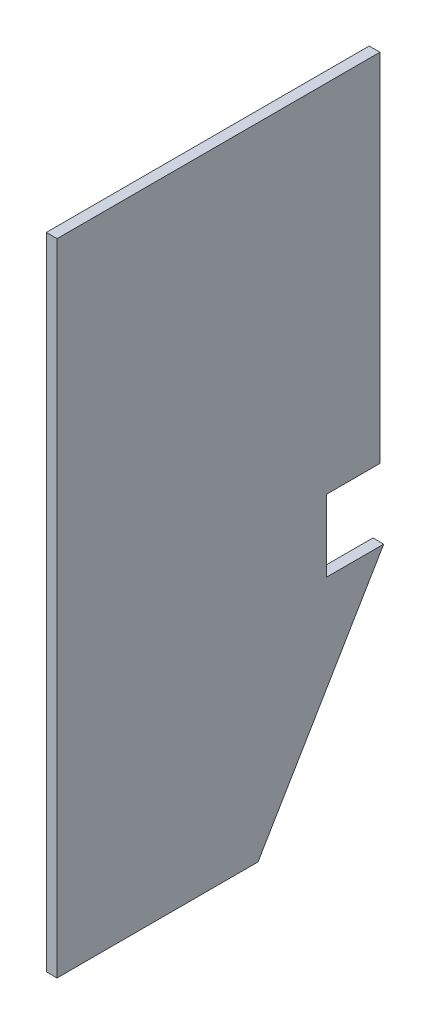
ISO-10303-21;
HEADER;
FILE_DESCRIPTION(('STEP AP214'),'2;1');
FILE_NAME('part.step','',(''),(''),'','','');
FILE_SCHEMA(('AUTOMOTIVE_DESIGN { 1 0 10303 214 1 1 1 1 }'));
ENDSEC;
DATA;
#1=APPLICATION_CONTEXT('core data for automotive mechanical design processes');
#2=APPLICATION_PROTOCOL_DEFINITION('international standard','automotive_design',2000,#1);
#3=PRODUCT_CONTEXT('',#1,'mechanical');
#4=PRODUCT('Part','Part','',(#3));
#5=PRODUCT_RELATED_PRODUCT_CATEGORY('part','',(#4));
#6=PRODUCT_DEFINITION_FORMATION('','',#4);
#7=PRODUCT_DEFINITION_CONTEXT('part definition',#1,'design');
#8=PRODUCT_DEFINITION('design','',#6,#7);
#9=PRODUCT_DEFINITION_SHAPE('','',#8);
#10=(LENGTH_UNIT() NAMED_UNIT(*) SI_UNIT(.MILLI.,.METRE.));
#11=(NAMED_UNIT(*) PLANE_ANGLE_UNIT() SI_UNIT($,.RADIAN.));
#12=(NAMED_UNIT(*) SI_UNIT($,.STERADIAN.) SOLID_ANGLE_UNIT());
#13=UNCERTAINTY_MEASURE_WITH_UNIT(LENGTH_MEASURE(1.E-05),#10,'distance_accuracy_value','');
#14=(GEOMETRIC_REPRESENTATION_CONTEXT(3) GLOBAL_UNCERTAINTY_ASSIGNED_CONTEXT((#13)) GLOBAL_UNIT_ASSIGNED_CONTEXT((#10,
#11,#12)) REPRESENTATION_CONTEXT('',''));
#15=CARTESIAN_POINT('',(0.,0.,0.));
#16=DIRECTION('',(0.,0.,1.));
#17=DIRECTION('',(1.,0.,0.));
#18=AXIS2_PLACEMENT_3D('',#15,#16,#17);
#19=CARTESIAN_POINT('',(6.,13.1217789679627,-475.450700314653));
#20=DIRECTION('',(0.,1.,0.));
#21=DIRECTION('',(0.,0.,-1.));
#22=AXIS2_PLACEMENT_3D('',#19,#20,#21);
#23=PLANE('',#22);
#24=DIRECTION('',(0.,0.,1.));
#25=VECTOR('',#24,1.);
#26=CARTESIAN_POINT('',(0.,13.1217789679627,-475.450700314653));
#27=LINE('',#26,#25);
#28=CARTESIAN_POINT('',(0.,13.1217789679627,-505.119316824062));
#29=VERTEX_POINT('',#28);
#30=CARTESIAN_POINT('',(0.,13.1217789679627,-475.450700314653));
#31=VERTEX_POINT('',#30);
#32=EDGE_CURVE('E138',#29,#31,#27,.T.);
#33=ORIENTED_EDGE('',*,*,#32,.F.);
#34=DIRECTION('',(-1.,0.,0.));
#35=VECTOR('',#34,1.);
#36=CARTESIAN_POINT('',(6.,13.1217789679627,-505.119316824062));
#37=LINE('',#36,#35);
#38=CARTESIAN_POINT('',(6.,13.1217789679627,-505.119316824062));
#39=VERTEX_POINT('',#38);
#40=EDGE_CURVE('E11',#39,#29,#37,.T.);
#41=ORIENTED_EDGE('',*,*,#40,.F.);
#42=DIRECTION('',(0.,0.,1.));
#43=VECTOR('',#42,1.);
#44=CARTESIAN_POINT('',(6.,13.1217789679627,-475.450700314653));
#45=LINE('',#44,#43);
#46=CARTESIAN_POINT('',(6.,13.1217789679627,-475.450700314653));
#47=VERTEX_POINT('',#46);
#48=EDGE_CURVE('E169',#39,#47,#45,.T.);
#49=ORIENTED_EDGE('',*,*,#48,.T.);
#50=DIRECTION('',(-1.,0.,0.));
#51=VECTOR('',#50,1.);
#52=CARTESIAN_POINT('',(6.,13.1217789679627,-475.450700314653));
#53=LINE('',#52,#51);
#54=EDGE_CURVE('E49',#47,#31,#53,.T.);
#55=ORIENTED_EDGE('',*,*,#54,.T.);
#56=EDGE_LOOP('',(#33,#41,#49,#55));
#57=FACE_BOUND('',#56,.T.);
#58=ADVANCED_FACE('F41',(#57),#23,.F.);
#59=CARTESIAN_POINT('',(6.,-26.8782210320373,-475.450700314653));
#60=DIRECTION('',(0.,0.,1.));
#61=DIRECTION('',(-1.,0.,0.));
#62=AXIS2_PLACEMENT_3D('',#59,#60,#61);
#63=PLANE('',#62);
#64=DIRECTION('',(0.,-1.,0.));
#65=VECTOR('',#64,1.);
#66=CARTESIAN_POINT('',(0.,-26.8782210320373,-475.450700314653));
#67=LINE('',#66,#65);
#68=CARTESIAN_POINT('',(0.,-26.8782210320373,-475.450700314653));
#69=VERTEX_POINT('',#68);
#70=EDGE_CURVE('E141',#31,#69,#67,.T.);
#71=ORIENTED_EDGE('',*,*,#70,.F.);
#72=ORIENTED_EDGE('',*,*,#54,.F.);
#73=DIRECTION('',(0.,-1.,0.));
#74=VECTOR('',#73,1.);
#75=CARTESIAN_POINT('',(6.,-26.8782210320373,-475.450700314653));
#76=LINE('',#75,#74);
#77=CARTESIAN_POINT('',(6.,-26.8782210320373,-475.450700314653));
#78=VERTEX_POINT('',#77);
#79=EDGE_CURVE('E265',#47,#78,#76,.T.);
#80=ORIENTED_EDGE('',*,*,#79,.T.);
#81=DIRECTION('',(-1.,0.,0.));
#82=VECTOR('',#81,1.);
#83=CARTESIAN_POINT('',(6.,-26.8782210320373,-475.450700314653));
#84=LINE('',#83,#82);
#85=EDGE_CURVE('E161',#78,#69,#84,.T.);
#86=ORIENTED_EDGE('',*,*,#85,.T.);
#87=EDGE_LOOP('',(#71,#72,#80,#86));
#88=FACE_BOUND('',#87,.T.);
#89=ADVANCED_FACE('F186',(#88),#63,.F.);
#90=CARTESIAN_POINT('',(6.,-26.8782210320373,-507.239741781729));
#91=DIRECTION('',(0.,-1.,0.));
#92=DIRECTION('',(0.,0.,1.));
#93=AXIS2_PLACEMENT_3D('',#90,#91,#92);
#94=PLANE('',#93);
#95=DIRECTION('',(0.,0.,-1.));
#96=VECTOR('',#95,1.);
#97=CARTESIAN_POINT('',(0.,-26.8782210320373,-507.239741781729));
#98=LINE('',#97,#96);
#99=CARTESIAN_POINT('',(0.,-26.8782210320373,-507.239741781729));
#100=VERTEX_POINT('',#99);
#101=EDGE_CURVE('E144',#69,#100,#98,.T.);
#102=ORIENTED_EDGE('',*,*,#101,.F.);
#103=ORIENTED_EDGE('',*,*,#85,.F.);
#104=DIRECTION('',(0.,0.,-1.));
#105=VECTOR('',#104,1.);
#106=CARTESIAN_POINT('',(6.,-26.8782210320373,-507.239741781729));
#107=LINE('',#106,#105);
#108=CARTESIAN_POINT('',(6.,-26.8782210320373,-507.239741781729));
#109=VERTEX_POINT('',#108);
#110=EDGE_CURVE('E132',#78,#109,#107,.T.);
#111=ORIENTED_EDGE('',*,*,#110,.T.);
#112=DIRECTION('',(-1.,0.,0.));
#113=VECTOR('',#112,1.);
#114=CARTESIAN_POINT('',(6.,-26.8782210320373,-507.239741781729));
#115=LINE('',#114,#113);
#116=EDGE_CURVE('E158',#109,#100,#115,.T.);
#117=ORIENTED_EDGE('',*,*,#116,.T.);
#118=EDGE_LOOP('',(#102,#103,#111,#117));
#119=FACE_BOUND('',#118,.T.);
#120=ADVANCED_FACE('F190',(#119),#94,.F.);
#121=CARTESIAN_POINT('',(6.,-145.274480774253,-437.151578540946));
#122=DIRECTION('',(0.,0.509411899642269,0.860522815794477));
#123=DIRECTION('',(0.,0.860522815794477,-0.509411899642269));
#124=AXIS2_PLACEMENT_3D('',#121,#122,#123);
#125=PLANE('',#124);
#126=DIRECTION('',(0.,-0.860522815794477,0.509411899642269));
#127=VECTOR('',#126,1.);
#128=CARTESIAN_POINT('',(0.,-145.274480774253,-437.151578540946));
#129=LINE('',#128,#127);
#130=CARTESIAN_POINT('',(0.,-145.274480774253,-437.151578540946));
#131=VERTEX_POINT('',#130);
#132=EDGE_CURVE('E147',#100,#131,#129,.T.);
#133=ORIENTED_EDGE('',*,*,#132,.F.);
#134=ORIENTED_EDGE('',*,*,#116,.F.);
#135=DIRECTION('',(0.,-0.860522815794477,0.509411899642269));
#136=VECTOR('',#135,1.);
#137=CARTESIAN_POINT('',(6.,-145.274480774253,-437.151578540946));
#138=LINE('',#137,#136);
#139=CARTESIAN_POINT('',(6.,-145.274480774253,-437.151578540946));
#140=VERTEX_POINT('',#139);
#141=EDGE_CURVE('E130',#109,#140,#138,.T.);
#142=ORIENTED_EDGE('',*,*,#141,.T.);
#143=DIRECTION('',(-1.,0.,0.));
#144=VECTOR('',#143,1.);
#145=CARTESIAN_POINT('',(6.,-145.274480774253,-437.151578540946));
#146=LINE('',#145,#144);
#147=EDGE_CURVE('E124',#140,#131,#146,.T.);
#148=ORIENTED_EDGE('',*,*,#147,.T.);
#149=EDGE_LOOP('',(#133,#134,#142,#148));
#150=FACE_BOUND('',#149,.T.);
#151=ADVANCED_FACE('F194',(#150),#125,.F.);
#152=CARTESIAN_POINT('',(6.,-145.274480774253,-325.119316824062));
#153=DIRECTION('',(0.,1.,0.));
#154=DIRECTION('',(0.,0.,-1.));
#155=AXIS2_PLACEMENT_3D('',#152,#153,#154);
#156=PLANE('',#155);
#157=DIRECTION('',(0.,0.,1.));
#158=VECTOR('',#157,1.);
#159=CARTESIAN_POINT('',(0.,-145.274480774253,-325.119316824062));
#160=LINE('',#159,#158);
#161=CARTESIAN_POINT('',(0.,-145.274480774253,-325.119316824062));
#162=VERTEX_POINT('',#161);
#163=EDGE_CURVE('E150',#131,#162,#160,.T.);
#164=ORIENTED_EDGE('',*,*,#163,.F.);
#165=ORIENTED_EDGE('',*,*,#147,.F.);
#166=DIRECTION('',(0.,0.,1.));
#167=VECTOR('',#166,1.);
#168=CARTESIAN_POINT('',(6.,-145.274480774253,-325.119316824062));
#169=LINE('',#168,#167);
#170=CARTESIAN_POINT('',(6.,-145.274480774253,-325.119316824062));
#171=VERTEX_POINT('',#170);
#172=EDGE_CURVE('E111',#140,#171,#169,.T.);
#173=ORIENTED_EDGE('',*,*,#172,.T.);
#174=DIRECTION('',(-1.,0.,0.));
#175=VECTOR('',#174,1.);
#176=CARTESIAN_POINT('',(6.,-145.274480774253,-325.119316824062));
#177=LINE('',#176,#175);
#178=EDGE_CURVE('E118',#171,#162,#177,.T.);
#179=ORIENTED_EDGE('',*,*,#178,.T.);
#180=EDGE_LOOP('',(#164,#165,#173,#179));
#181=FACE_BOUND('',#180,.T.);
#182=ADVANCED_FACE('F127',(#181),#156,.F.);
#183=CARTESIAN_POINT('',(6.,-145.274480774253,-325.119316824062));
#184=DIRECTION('',(0.,0.,-1.));
#185=DIRECTION('',(1.,0.,0.));
#186=AXIS2_PLACEMENT_3D('',#183,#184,#185);
#187=PLANE('',#186);
#188=DIRECTION('',(0.,1.,0.));
#189=VECTOR('',#188,1.);
#190=CARTESIAN_POINT('',(0.,-145.274480774253,-325.119316824062));
#191=LINE('',#190,#189);
#192=CARTESIAN_POINT('',(0.,211.645247630356,-325.119316824062));
#193=VERTEX_POINT('',#192);
#194=EDGE_CURVE('E121',#162,#193,#191,.T.);
#195=ORIENTED_EDGE('',*,*,#194,.F.);
#196=ORIENTED_EDGE('',*,*,#178,.F.);
#197=DIRECTION('',(0.,1.,0.));
#198=VECTOR('',#197,1.);
#199=CARTESIAN_POINT('',(6.,-145.274480774253,-325.119316824062));
#200=LINE('',#199,#198);
#201=CARTESIAN_POINT('',(6.,211.645247630356,-325.119316824062));
#202=VERTEX_POINT('',#201);
#203=EDGE_CURVE('E107',#171,#202,#200,.T.);
#204=ORIENTED_EDGE('',*,*,#203,.T.);
#205=DIRECTION('',(-1.,0.,0.));
#206=VECTOR('',#205,1.);
#207=CARTESIAN_POINT('',(6.,211.645247630356,-325.119316824062));
#208=LINE('',#207,#206);
#209=EDGE_CURVE('E125',#202,#193,#208,.T.);
#210=ORIENTED_EDGE('',*,*,#209,.T.);
#211=EDGE_LOOP('',(#195,#196,#204,#210));
#212=FACE_BOUND('',#211,.T.);
#213=ADVANCED_FACE('F119',(#212),#187,.F.);
#214=CARTESIAN_POINT('',(6.,211.645247630356,-505.119316824062));
#215=DIRECTION('',(0.,-1.,0.));
#216=DIRECTION('',(0.,0.,1.));
#217=AXIS2_PLACEMENT_3D('',#214,#215,#216);
#218=PLANE('',#217);
#219=DIRECTION('',(0.,0.,-1.));
#220=VECTOR('',#219,1.);
#221=CARTESIAN_POINT('',(0.,211.645247630356,-505.119316824062));
#222=LINE('',#221,#220);
#223=CARTESIAN_POINT('',(0.,211.645247630356,-505.119316824062));
#224=VERTEX_POINT('',#223);
#225=EDGE_CURVE('E86',#193,#224,#222,.T.);
#226=ORIENTED_EDGE('',*,*,#225,.F.);
#227=ORIENTED_EDGE('',*,*,#209,.F.);
#228=DIRECTION('',(0.,0.,-1.));
#229=VECTOR('',#228,1.);
#230=CARTESIAN_POINT('',(6.,211.645247630356,-505.119316824062));
#231=LINE('',#230,#229);
#232=CARTESIAN_POINT('',(6.,211.645247630356,-505.119316824062));
#233=VERTEX_POINT('',#232);
#234=EDGE_CURVE('E114',#202,#233,#231,.T.);
#235=ORIENTED_EDGE('',*,*,#234,.T.);
#236=DIRECTION('',(-1.,0.,0.));
#237=VECTOR('',#236,1.);
#238=CARTESIAN_POINT('',(6.,211.645247630356,-505.119316824062));
#239=LINE('',#238,#237);
#240=EDGE_CURVE('E137',#233,#224,#239,.T.);
#241=ORIENTED_EDGE('',*,*,#240,.T.);
#242=EDGE_LOOP('',(#226,#227,#235,#241));
#243=FACE_BOUND('',#242,.T.);
#244=ADVANCED_FACE('F176',(#243),#218,.F.);
#245=CARTESIAN_POINT('',(6.,150.999999999995,-505.119316824062));
#246=DIRECTION('',(0.,0.,1.));
#247=DIRECTION('',(-1.,0.,0.));
#248=AXIS2_PLACEMENT_3D('',#245,#246,#247);
#249=PLANE('',#248);
#250=DIRECTION('',(0.,-1.,0.));
#251=VECTOR('',#250,1.);
#252=CARTESIAN_POINT('',(0.,150.999999999995,-505.119316824062));
#253=LINE('',#252,#251);
#254=EDGE_CURVE('E91',#224,#29,#253,.T.);
#255=ORIENTED_EDGE('',*,*,#254,.F.);
#256=ORIENTED_EDGE('',*,*,#240,.F.);
#257=DIRECTION('',(0.,-1.,0.));
#258=VECTOR('',#257,1.);
#259=CARTESIAN_POINT('',(6.,13.1217789679627,-505.119316824062));
#260=LINE('',#259,#258);
#261=EDGE_CURVE('E57',#233,#39,#260,.T.);
#262=ORIENTED_EDGE('',*,*,#261,.T.);
#263=ORIENTED_EDGE('',*,*,#40,.T.);
#264=EDGE_LOOP('',(#255,#256,#262,#263));
#265=FACE_BOUND('',#264,.T.);
#266=ADVANCED_FACE('F174',(#265),#249,.F.);
#267=CARTESIAN_POINT('',(6.,0.,0.));
#268=DIRECTION('',(-1.,0.,0.));
#269=DIRECTION('',(0.,0.,-1.));
#270=AXIS2_PLACEMENT_3D('',#267,#268,#269);
#271=PLANE('',#270);
#272=ORIENTED_EDGE('',*,*,#261,.F.);
#273=ORIENTED_EDGE('',*,*,#234,.F.);
#274=ORIENTED_EDGE('',*,*,#203,.F.);
#275=ORIENTED_EDGE('',*,*,#172,.F.);
#276=ORIENTED_EDGE('',*,*,#141,.F.);
#277=ORIENTED_EDGE('',*,*,#110,.F.);
#278=ORIENTED_EDGE('',*,*,#79,.F.);
#279=ORIENTED_EDGE('',*,*,#48,.F.);
#280=EDGE_LOOP('',(#272,#273,#274,#275,#276,#277,#278,#279));
#281=FACE_BOUND('',#280,.T.);
#282=ADVANCED_FACE('F109',(#281),#271,.F.);
#283=CARTESIAN_POINT('',(0.,0.,0.));
#284=DIRECTION('',(-1.,0.,0.));
#285=DIRECTION('',(0.,0.,-1.));
#286=AXIS2_PLACEMENT_3D('',#283,#284,#285);
#287=PLANE('',#286);
#288=ORIENTED_EDGE('',*,*,#32,.T.);
#289=ORIENTED_EDGE('',*,*,#70,.T.);
#290=ORIENTED_EDGE('',*,*,#101,.T.);
#291=ORIENTED_EDGE('',*,*,#132,.T.);
#292=ORIENTED_EDGE('',*,*,#163,.T.);
#293=ORIENTED_EDGE('',*,*,#194,.T.);
#294=ORIENTED_EDGE('',*,*,#225,.T.);
#295=ORIENTED_EDGE('',*,*,#254,.T.);
#296=EDGE_LOOP('',(#288,#289,#290,#291,#292,#293,#294,#295));
#297=FACE_BOUND('',#296,.T.);
#298=ADVANCED_FACE('F173',(#297),#287,.T.);
#299=CLOSED_SHELL('',(#58,#89,#120,#151,#182,#213,#244,#266,#282,#298));
#300=MANIFOLD_SOLID_BREP('B2',#299);
#301=ADVANCED_BREP_SHAPE_REPRESENTATION('',(#18,#300),#14);
#302=SHAPE_DEFINITION_REPRESENTATION(#9,#301);
ENDSEC;
END-ISO-10303-21;
